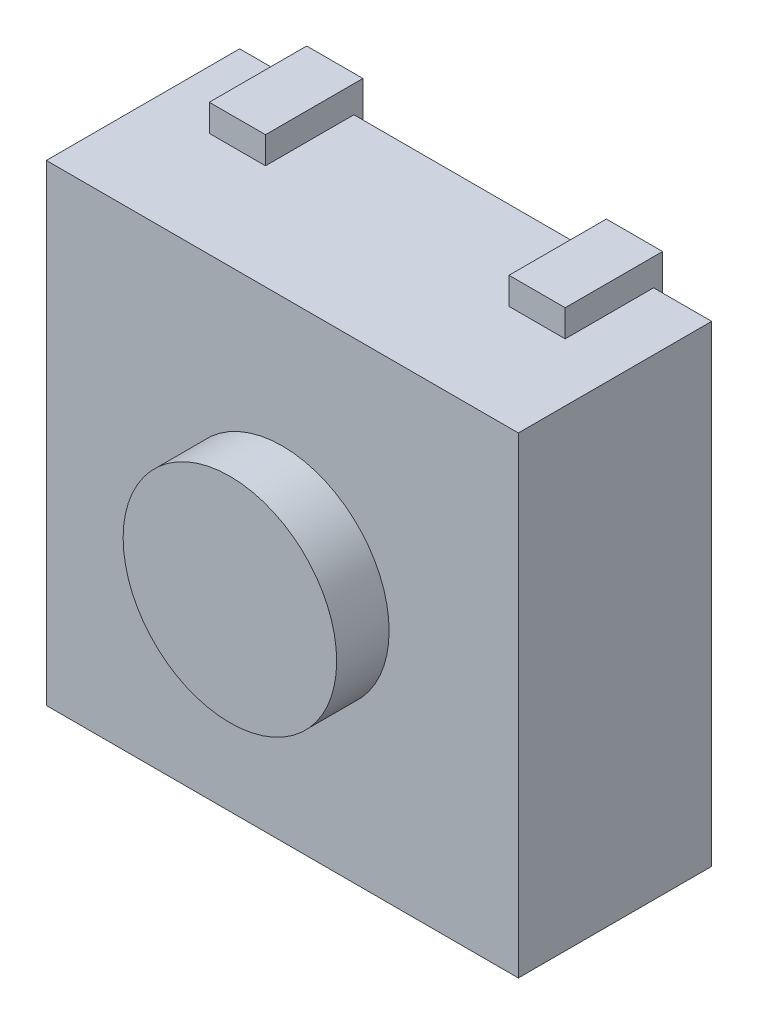
ISO-10303-21;
HEADER;
FILE_DESCRIPTION(('STEP AP214'),'2;1');
FILE_NAME('part.step','',(''),(''),'','','');
FILE_SCHEMA(('AUTOMOTIVE_DESIGN { 1 0 10303 214 1 1 1 1 }'));
ENDSEC;
DATA;
#1=APPLICATION_CONTEXT('core data for automotive mechanical design processes');
#2=APPLICATION_PROTOCOL_DEFINITION('international standard','automotive_design',2000,#1);
#3=PRODUCT_CONTEXT('',#1,'mechanical');
#4=PRODUCT('Part','Part','',(#3));
#5=PRODUCT_RELATED_PRODUCT_CATEGORY('part','',(#4));
#6=PRODUCT_DEFINITION_FORMATION('','',#4);
#7=PRODUCT_DEFINITION_CONTEXT('part definition',#1,'design');
#8=PRODUCT_DEFINITION('design','',#6,#7);
#9=PRODUCT_DEFINITION_SHAPE('','',#8);
#10=(LENGTH_UNIT() NAMED_UNIT(*) SI_UNIT(.MILLI.,.METRE.));
#11=(NAMED_UNIT(*) PLANE_ANGLE_UNIT() SI_UNIT($,.RADIAN.));
#12=(NAMED_UNIT(*) SI_UNIT($,.STERADIAN.) SOLID_ANGLE_UNIT());
#13=UNCERTAINTY_MEASURE_WITH_UNIT(LENGTH_MEASURE(1.E-05),#10,'distance_accuracy_value','');
#14=(GEOMETRIC_REPRESENTATION_CONTEXT(3) GLOBAL_UNCERTAINTY_ASSIGNED_CONTEXT((#13)) GLOBAL_UNIT_ASSIGNED_CONTEXT((#10,
#11,#12)) REPRESENTATION_CONTEXT('',''));
#15=CARTESIAN_POINT('',(0.,0.,0.));
#16=DIRECTION('',(0.,0.,1.));
#17=DIRECTION('',(1.,0.,0.));
#18=AXIS2_PLACEMENT_3D('',#15,#16,#17);
#19=CARTESIAN_POINT('',(0.,0.,0.12));
#20=DIRECTION('',(0.,0.,-1.));
#21=DIRECTION('',(-1.,0.,0.));
#22=AXIS2_PLACEMENT_3D('',#19,#20,#21);
#23=PLANE('',#22);
#24=DIRECTION('',(-1.,0.,0.));
#25=VECTOR('',#24,1.);
#26=CARTESIAN_POINT('',(0.,-1.9,0.12));
#27=LINE('',#26,#25);
#28=CARTESIAN_POINT('',(2.375,-1.9,0.12));
#29=VERTEX_POINT('',#28);
#30=CARTESIAN_POINT('',(1.625,-1.9,0.12));
#31=VERTEX_POINT('',#30);
#32=EDGE_CURVE('E12',#29,#31,#27,.T.);
#33=ORIENTED_EDGE('',*,*,#32,.T.);
#34=DIRECTION('',(0.,-1.,0.));
#35=VECTOR('',#34,1.);
#36=CARTESIAN_POINT('',(1.625,0.,0.12));
#37=LINE('',#36,#35);
#38=CARTESIAN_POINT('',(1.625,-3.15,0.12));
#39=VERTEX_POINT('',#38);
#40=EDGE_CURVE('E247',#31,#39,#37,.T.);
#41=ORIENTED_EDGE('',*,*,#40,.T.);
#42=DIRECTION('',(1.,0.,0.));
#43=VECTOR('',#42,1.);
#44=CARTESIAN_POINT('',(-3.15,-3.15,0.12));
#45=LINE('',#44,#43);
#46=CARTESIAN_POINT('',(-1.625,-3.15,0.12));
#47=VERTEX_POINT('',#46);
#48=EDGE_CURVE('E395',#47,#39,#45,.T.);
#49=ORIENTED_EDGE('',*,*,#48,.F.);
#50=DIRECTION('',(0.,-1.,0.));
#51=VECTOR('',#50,1.);
#52=CARTESIAN_POINT('',(-1.625,0.,0.12));
#53=LINE('',#52,#51);
#54=CARTESIAN_POINT('',(-1.625,-1.9,0.12));
#55=VERTEX_POINT('',#54);
#56=EDGE_CURVE('E285',#55,#47,#53,.T.);
#57=ORIENTED_EDGE('',*,*,#56,.F.);
#58=DIRECTION('',(1.,0.,0.));
#59=VECTOR('',#58,1.);
#60=CARTESIAN_POINT('',(0.,-1.9,0.12));
#61=LINE('',#60,#59);
#62=CARTESIAN_POINT('',(-2.375,-1.9,0.12));
#63=VERTEX_POINT('',#62);
#64=EDGE_CURVE('E425',#63,#55,#61,.T.);
#65=ORIENTED_EDGE('',*,*,#64,.F.);
#66=DIRECTION('',(0.,1.,0.));
#67=VECTOR('',#66,1.);
#68=CARTESIAN_POINT('',(-2.375,0.,0.12));
#69=LINE('',#68,#67);
#70=CARTESIAN_POINT('',(-2.375,-3.15,0.12));
#71=VERTEX_POINT('',#70);
#72=EDGE_CURVE('E282',#71,#63,#69,.T.);
#73=ORIENTED_EDGE('',*,*,#72,.F.);
#74=CARTESIAN_POINT('',(-3.15,-3.15,0.12));
#75=VERTEX_POINT('',#74);
#76=EDGE_CURVE('E366',#75,#71,#45,.T.);
#77=ORIENTED_EDGE('',*,*,#76,.F.);
#78=DIRECTION('',(0.,-1.,0.));
#79=VECTOR('',#78,1.);
#80=CARTESIAN_POINT('',(-3.15,-3.15,0.12));
#81=LINE('',#80,#79);
#82=CARTESIAN_POINT('',(-3.15,3.15,0.12));
#83=VERTEX_POINT('',#82);
#84=EDGE_CURVE('E389',#83,#75,#81,.T.);
#85=ORIENTED_EDGE('',*,*,#84,.F.);
#86=DIRECTION('',(-1.,0.,0.));
#87=VECTOR('',#86,1.);
#88=CARTESIAN_POINT('',(-3.15,3.15,0.12));
#89=LINE('',#88,#87);
#90=CARTESIAN_POINT('',(-2.375,3.15,0.12));
#91=VERTEX_POINT('',#90);
#92=EDGE_CURVE('E385',#91,#83,#89,.T.);
#93=ORIENTED_EDGE('',*,*,#92,.F.);
#94=DIRECTION('',(0.,-1.,0.));
#95=VECTOR('',#94,1.);
#96=CARTESIAN_POINT('',(-2.375,0.,0.12));
#97=LINE('',#96,#95);
#98=CARTESIAN_POINT('',(-2.375,1.9,0.12));
#99=VERTEX_POINT('',#98);
#100=EDGE_CURVE('E398',#91,#99,#97,.T.);
#101=ORIENTED_EDGE('',*,*,#100,.T.);
#102=DIRECTION('',(1.,0.,0.));
#103=VECTOR('',#102,1.);
#104=CARTESIAN_POINT('',(0.,1.9,0.12));
#105=LINE('',#104,#103);
#106=CARTESIAN_POINT('',(-1.625,1.9,0.12));
#107=VERTEX_POINT('',#106);
#108=EDGE_CURVE('E360',#99,#107,#105,.T.);
#109=ORIENTED_EDGE('',*,*,#108,.T.);
#110=DIRECTION('',(0.,1.,0.));
#111=VECTOR('',#110,1.);
#112=CARTESIAN_POINT('',(-1.625,0.,0.12));
#113=LINE('',#112,#111);
#114=CARTESIAN_POINT('',(-1.625,3.15,0.12));
#115=VERTEX_POINT('',#114);
#116=EDGE_CURVE('E401',#107,#115,#113,.T.);
#117=ORIENTED_EDGE('',*,*,#116,.T.);
#118=CARTESIAN_POINT('',(1.625,3.15,0.12));
#119=VERTEX_POINT('',#118);
#120=EDGE_CURVE('E390',#119,#115,#89,.T.);
#121=ORIENTED_EDGE('',*,*,#120,.F.);
#122=DIRECTION('',(0.,1.,0.));
#123=VECTOR('',#122,1.);
#124=CARTESIAN_POINT('',(1.625,0.,0.12));
#125=LINE('',#124,#123);
#126=CARTESIAN_POINT('',(1.625,1.9,0.12));
#127=VERTEX_POINT('',#126);
#128=EDGE_CURVE('E412',#127,#119,#125,.T.);
#129=ORIENTED_EDGE('',*,*,#128,.F.);
#130=DIRECTION('',(-1.,0.,0.));
#131=VECTOR('',#130,1.);
#132=CARTESIAN_POINT('',(0.,1.9,0.12));
#133=LINE('',#132,#131);
#134=CARTESIAN_POINT('',(2.375,1.9,0.12));
#135=VERTEX_POINT('',#134);
#136=EDGE_CURVE('E409',#135,#127,#133,.T.);
#137=ORIENTED_EDGE('',*,*,#136,.F.);
#138=DIRECTION('',(0.,-1.,0.));
#139=VECTOR('',#138,1.);
#140=CARTESIAN_POINT('',(2.375,0.,0.12));
#141=LINE('',#140,#139);
#142=CARTESIAN_POINT('',(2.375,3.15,0.12));
#143=VERTEX_POINT('',#142);
#144=EDGE_CURVE('E406',#143,#135,#141,.T.);
#145=ORIENTED_EDGE('',*,*,#144,.F.);
#146=CARTESIAN_POINT('',(3.15,3.15,0.12));
#147=VERTEX_POINT('',#146);
#148=EDGE_CURVE('E386',#147,#143,#89,.T.);
#149=ORIENTED_EDGE('',*,*,#148,.F.);
#150=DIRECTION('',(0.,1.,0.));
#151=VECTOR('',#150,1.);
#152=CARTESIAN_POINT('',(3.15,-3.15,0.12));
#153=LINE('',#152,#151);
#154=CARTESIAN_POINT('',(3.15,-3.15,0.12));
#155=VERTEX_POINT('',#154);
#156=EDGE_CURVE('E356',#155,#147,#153,.T.);
#157=ORIENTED_EDGE('',*,*,#156,.F.);
#158=CARTESIAN_POINT('',(2.375,-3.15,0.12));
#159=VERTEX_POINT('',#158);
#160=EDGE_CURVE('E392',#159,#155,#45,.T.);
#161=ORIENTED_EDGE('',*,*,#160,.F.);
#162=DIRECTION('',(0.,1.,0.));
#163=VECTOR('',#162,1.);
#164=CARTESIAN_POINT('',(2.375,0.,0.12));
#165=LINE('',#164,#163);
#166=EDGE_CURVE('E57',#159,#29,#165,.T.);
#167=ORIENTED_EDGE('',*,*,#166,.T.);
#168=EDGE_LOOP('',(#33,#41,#49,#57,#65,#73,#77,#85,#93,#101,#109,#117,#121,#129,#137,#145,#149,
#157,#161,#167));
#169=FACE_BOUND('',#168,.T.);
#170=ADVANCED_FACE('F40',(#169),#23,.T.);
#171=CARTESIAN_POINT('',(-3.15,-3.15,2.7));
#172=DIRECTION('',(0.,1.,0.));
#173=DIRECTION('',(0.,0.,1.));
#174=AXIS2_PLACEMENT_3D('',#171,#172,#173);
#175=PLANE('',#174);
#176=DIRECTION('',(0.,0.,-1.));
#177=VECTOR('',#176,1.);
#178=CARTESIAN_POINT('',(1.625,-3.15,2.7));
#179=LINE('',#178,#177);
#180=CARTESIAN_POINT('',(1.625,-3.15,1.3));
#181=VERTEX_POINT('',#180);
#182=EDGE_CURVE('E47',#181,#39,#179,.T.);
#183=ORIENTED_EDGE('',*,*,#182,.F.);
#184=DIRECTION('',(-1.,0.,0.));
#185=VECTOR('',#184,1.);
#186=CARTESIAN_POINT('',(-3.15,-3.15,1.3));
#187=LINE('',#186,#185);
#188=CARTESIAN_POINT('',(2.375,-3.15,1.3));
#189=VERTEX_POINT('',#188);
#190=EDGE_CURVE('E227',#189,#181,#187,.T.);
#191=ORIENTED_EDGE('',*,*,#190,.F.);
#192=DIRECTION('',(0.,0.,1.));
#193=VECTOR('',#192,1.);
#194=CARTESIAN_POINT('',(2.375,-3.15,2.7));
#195=LINE('',#194,#193);
#196=EDGE_CURVE('E429',#159,#189,#195,.T.);
#197=ORIENTED_EDGE('',*,*,#196,.F.);
#198=ORIENTED_EDGE('',*,*,#160,.T.);
#199=DIRECTION('',(0.,0.,-1.));
#200=VECTOR('',#199,1.);
#201=CARTESIAN_POINT('',(3.15,-3.15,2.7));
#202=LINE('',#201,#200);
#203=CARTESIAN_POINT('',(3.15,-3.15,2.7));
#204=VERTEX_POINT('',#203);
#205=EDGE_CURVE('E372',#204,#155,#202,.T.);
#206=ORIENTED_EDGE('',*,*,#205,.F.);
#207=DIRECTION('',(1.,0.,0.));
#208=VECTOR('',#207,1.);
#209=CARTESIAN_POINT('',(-3.15,-3.15,2.7));
#210=LINE('',#209,#208);
#211=CARTESIAN_POINT('',(-3.15,-3.15,2.7));
#212=VERTEX_POINT('',#211);
#213=EDGE_CURVE('E370',#212,#204,#210,.T.);
#214=ORIENTED_EDGE('',*,*,#213,.F.);
#215=DIRECTION('',(0.,0.,-1.));
#216=VECTOR('',#215,1.);
#217=CARTESIAN_POINT('',(-3.15,-3.15,2.7));
#218=LINE('',#217,#216);
#219=EDGE_CURVE('E375',#212,#75,#218,.T.);
#220=ORIENTED_EDGE('',*,*,#219,.T.);
#221=ORIENTED_EDGE('',*,*,#76,.T.);
#222=DIRECTION('',(0.,0.,1.));
#223=VECTOR('',#222,1.);
#224=CARTESIAN_POINT('',(-2.375,-3.15,2.7));
#225=LINE('',#224,#223);
#226=CARTESIAN_POINT('',(-2.375,-3.15,1.3));
#227=VERTEX_POINT('',#226);
#228=EDGE_CURVE('E421',#71,#227,#225,.T.);
#229=ORIENTED_EDGE('',*,*,#228,.T.);
#230=DIRECTION('',(-1.,0.,0.));
#231=VECTOR('',#230,1.);
#232=CARTESIAN_POINT('',(-3.15,-3.15,1.3));
#233=LINE('',#232,#231);
#234=CARTESIAN_POINT('',(-1.625,-3.15,1.3));
#235=VERTEX_POINT('',#234);
#236=EDGE_CURVE('E418',#235,#227,#233,.T.);
#237=ORIENTED_EDGE('',*,*,#236,.F.);
#238=DIRECTION('',(0.,0.,-1.));
#239=VECTOR('',#238,1.);
#240=CARTESIAN_POINT('',(-1.625,-3.15,2.7));
#241=LINE('',#240,#239);
#242=EDGE_CURVE('E423',#235,#47,#241,.T.);
#243=ORIENTED_EDGE('',*,*,#242,.T.);
#244=ORIENTED_EDGE('',*,*,#48,.T.);
#245=EDGE_LOOP('',(#183,#191,#197,#198,#206,#214,#220,#221,#229,#237,#243,#244));
#246=FACE_BOUND('',#245,.T.);
#247=ADVANCED_FACE('F434',(#246),#175,.F.);
#248=CARTESIAN_POINT('',(-3.15,3.15,2.7));
#249=DIRECTION('',(0.,-1.,0.));
#250=DIRECTION('',(0.,0.,-1.));
#251=AXIS2_PLACEMENT_3D('',#248,#249,#250);
#252=PLANE('',#251);
#253=DIRECTION('',(1.,0.,0.));
#254=VECTOR('',#253,1.);
#255=CARTESIAN_POINT('',(-3.15,3.15,1.3));
#256=LINE('',#255,#254);
#257=CARTESIAN_POINT('',(1.625,3.15,1.3));
#258=VERTEX_POINT('',#257);
#259=CARTESIAN_POINT('',(2.375,3.15,1.3));
#260=VERTEX_POINT('',#259);
#261=EDGE_CURVE('E415',#258,#260,#256,.T.);
#262=ORIENTED_EDGE('',*,*,#261,.F.);
#263=DIRECTION('',(0.,0.,-1.));
#264=VECTOR('',#263,1.);
#265=CARTESIAN_POINT('',(1.625,3.15,2.7));
#266=LINE('',#265,#264);
#267=EDGE_CURVE('E318',#258,#119,#266,.T.);
#268=ORIENTED_EDGE('',*,*,#267,.T.);
#269=ORIENTED_EDGE('',*,*,#120,.T.);
#270=DIRECTION('',(0.,0.,-1.));
#271=VECTOR('',#270,1.);
#272=CARTESIAN_POINT('',(-1.625,3.15,2.7));
#273=LINE('',#272,#271);
#274=CARTESIAN_POINT('',(-1.625,3.15,1.3));
#275=VERTEX_POINT('',#274);
#276=EDGE_CURVE('E350',#275,#115,#273,.T.);
#277=ORIENTED_EDGE('',*,*,#276,.F.);
#278=DIRECTION('',(1.,0.,0.));
#279=VECTOR('',#278,1.);
#280=CARTESIAN_POINT('',(-3.15,3.15,1.3));
#281=LINE('',#280,#279);
#282=CARTESIAN_POINT('',(-2.375,3.15,1.3));
#283=VERTEX_POINT('',#282);
#284=EDGE_CURVE('E404',#283,#275,#281,.T.);
#285=ORIENTED_EDGE('',*,*,#284,.F.);
#286=DIRECTION('',(0.,0.,1.));
#287=VECTOR('',#286,1.);
#288=CARTESIAN_POINT('',(-2.375,3.15,2.7));
#289=LINE('',#288,#287);
#290=EDGE_CURVE('E348',#91,#283,#289,.T.);
#291=ORIENTED_EDGE('',*,*,#290,.F.);
#292=ORIENTED_EDGE('',*,*,#92,.T.);
#293=DIRECTION('',(0.,0.,-1.));
#294=VECTOR('',#293,1.);
#295=CARTESIAN_POINT('',(-3.15,3.15,2.7));
#296=LINE('',#295,#294);
#297=CARTESIAN_POINT('',(-3.15,3.15,2.7));
#298=VERTEX_POINT('',#297);
#299=EDGE_CURVE('E378',#298,#83,#296,.T.);
#300=ORIENTED_EDGE('',*,*,#299,.F.);
#301=DIRECTION('',(-1.,0.,0.));
#302=VECTOR('',#301,1.);
#303=CARTESIAN_POINT('',(-3.15,3.15,2.7));
#304=LINE('',#303,#302);
#305=CARTESIAN_POINT('',(3.15,3.15,2.7));
#306=VERTEX_POINT('',#305);
#307=EDGE_CURVE('E365',#306,#298,#304,.T.);
#308=ORIENTED_EDGE('',*,*,#307,.F.);
#309=DIRECTION('',(0.,0.,-1.));
#310=VECTOR('',#309,1.);
#311=CARTESIAN_POINT('',(3.15,3.15,2.7));
#312=LINE('',#311,#310);
#313=EDGE_CURVE('E361',#306,#147,#312,.T.);
#314=ORIENTED_EDGE('',*,*,#313,.T.);
#315=ORIENTED_EDGE('',*,*,#148,.T.);
#316=DIRECTION('',(0.,0.,1.));
#317=VECTOR('',#316,1.);
#318=CARTESIAN_POINT('',(2.375,3.15,2.7));
#319=LINE('',#318,#317);
#320=EDGE_CURVE('E316',#143,#260,#319,.T.);
#321=ORIENTED_EDGE('',*,*,#320,.T.);
#322=EDGE_LOOP('',(#262,#268,#269,#277,#285,#291,#292,#300,#308,#314,#315,#321));
#323=FACE_BOUND('',#322,.T.);
#324=ADVANCED_FACE('F446',(#323),#252,.F.);
#325=CARTESIAN_POINT('',(3.15,-3.15,2.7));
#326=DIRECTION('',(-1.,0.,0.));
#327=DIRECTION('',(0.,0.,1.));
#328=AXIS2_PLACEMENT_3D('',#325,#326,#327);
#329=PLANE('',#328);
#330=ORIENTED_EDGE('',*,*,#156,.T.);
#331=ORIENTED_EDGE('',*,*,#313,.F.);
#332=DIRECTION('',(0.,1.,0.));
#333=VECTOR('',#332,1.);
#334=CARTESIAN_POINT('',(3.15,-3.15,2.7));
#335=LINE('',#334,#333);
#336=EDGE_CURVE('E362',#204,#306,#335,.T.);
#337=ORIENTED_EDGE('',*,*,#336,.F.);
#338=ORIENTED_EDGE('',*,*,#205,.T.);
#339=EDGE_LOOP('',(#330,#331,#337,#338));
#340=FACE_BOUND('',#339,.T.);
#341=ADVANCED_FACE('F442',(#340),#329,.F.);
#342=CARTESIAN_POINT('',(-3.15,-3.15,2.7));
#343=DIRECTION('',(1.,0.,0.));
#344=DIRECTION('',(0.,0.,-1.));
#345=AXIS2_PLACEMENT_3D('',#342,#343,#344);
#346=PLANE('',#345);
#347=ORIENTED_EDGE('',*,*,#84,.T.);
#348=ORIENTED_EDGE('',*,*,#219,.F.);
#349=DIRECTION('',(0.,-1.,0.));
#350=VECTOR('',#349,1.);
#351=CARTESIAN_POINT('',(-3.15,-3.15,2.7));
#352=LINE('',#351,#350);
#353=EDGE_CURVE('E368',#298,#212,#352,.T.);
#354=ORIENTED_EDGE('',*,*,#353,.F.);
#355=ORIENTED_EDGE('',*,*,#299,.T.);
#356=EDGE_LOOP('',(#347,#348,#354,#355));
#357=FACE_BOUND('',#356,.T.);
#358=ADVANCED_FACE('F502',(#357),#346,.F.);
#359=CARTESIAN_POINT('',(0.,0.,2.7));
#360=DIRECTION('',(0.,0.,-1.));
#361=DIRECTION('',(-1.,0.,0.));
#362=AXIS2_PLACEMENT_3D('',#359,#360,#361);
#363=PLANE('',#362);
#364=CARTESIAN_POINT('',(0.,0.,2.7));
#365=DIRECTION('',(0.,0.,-1.));
#366=DIRECTION('',(-1.,0.,0.));
#367=AXIS2_PLACEMENT_3D('',#364,#365,#366);
#368=CIRCLE('',#367,1.425);
#369=CARTESIAN_POINT('',(-1.425,0.,2.7));
#370=VERTEX_POINT('',#369);
#371=EDGE_CURVE('E357',#370,#370,#368,.F.);
#372=ORIENTED_EDGE('',*,*,#371,.F.);
#373=EDGE_LOOP('',(#372));
#374=FACE_BOUND('',#373,.T.);
#375=ORIENTED_EDGE('',*,*,#336,.T.);
#376=ORIENTED_EDGE('',*,*,#307,.T.);
#377=ORIENTED_EDGE('',*,*,#353,.T.);
#378=ORIENTED_EDGE('',*,*,#213,.T.);
#379=EDGE_LOOP('',(#375,#376,#377,#378));
#380=FACE_BOUND('',#379,.T.);
#381=ADVANCED_FACE('F450',(#374,#380),#363,.F.);
#382=CARTESIAN_POINT('',(0.,0.,3.4));
#383=DIRECTION('',(0.,0.,-1.));
#384=DIRECTION('',(-1.,0.,0.));
#385=AXIS2_PLACEMENT_3D('',#382,#383,#384);
#386=CYLINDRICAL_SURFACE('',#385,1.425);
#387=CARTESIAN_POINT('',(0.,0.,3.4));
#388=DIRECTION('',(0.,0.,1.));
#389=DIRECTION('',(1.,0.,0.));
#390=AXIS2_PLACEMENT_3D('',#387,#388,#389);
#391=CIRCLE('',#390,1.425);
#392=CARTESIAN_POINT('',(1.425,0.,3.4));
#393=VERTEX_POINT('',#392);
#394=EDGE_CURVE('E353',#393,#393,#391,.T.);
#395=ORIENTED_EDGE('',*,*,#394,.F.);
#396=EDGE_LOOP('',(#395));
#397=FACE_BOUND('',#396,.T.);
#398=ORIENTED_EDGE('',*,*,#371,.T.);
#399=EDGE_LOOP('',(#398));
#400=FACE_BOUND('',#399,.T.);
#401=ADVANCED_FACE('F751',(#397,#400),#386,.T.);
#402=CARTESIAN_POINT('',(0.,0.,3.4));
#403=DIRECTION('',(0.,0.,1.));
#404=DIRECTION('',(1.,0.,0.));
#405=AXIS2_PLACEMENT_3D('',#402,#403,#404);
#406=PLANE('',#405);
#407=ORIENTED_EDGE('',*,*,#394,.T.);
#408=EDGE_LOOP('',(#407));
#409=FACE_BOUND('',#408,.T.);
#410=ADVANCED_FACE('F512',(#409),#406,.T.);
#411=CARTESIAN_POINT('',(0.,0.,1.3));
#412=DIRECTION('',(0.,0.,-1.));
#413=DIRECTION('',(-1.,0.,0.));
#414=AXIS2_PLACEMENT_3D('',#411,#412,#413);
#415=PLANE('',#414);
#416=DIRECTION('',(0.,-1.,0.));
#417=VECTOR('',#416,1.);
#418=CARTESIAN_POINT('',(-2.375,3.51,1.3));
#419=LINE('',#418,#417);
#420=CARTESIAN_POINT('',(-2.375,3.51,1.3));
#421=VERTEX_POINT('',#420);
#422=EDGE_CURVE('E326',#421,#283,#419,.T.);
#423=ORIENTED_EDGE('',*,*,#422,.T.);
#424=ORIENTED_EDGE('',*,*,#284,.T.);
#425=DIRECTION('',(0.,1.,0.));
#426=VECTOR('',#425,1.);
#427=CARTESIAN_POINT('',(-1.625,1.9,1.3));
#428=LINE('',#427,#426);
#429=CARTESIAN_POINT('',(-1.625,3.51,1.3));
#430=VERTEX_POINT('',#429);
#431=EDGE_CURVE('E321',#275,#430,#428,.T.);
#432=ORIENTED_EDGE('',*,*,#431,.T.);
#433=DIRECTION('',(-1.,0.,0.));
#434=VECTOR('',#433,1.);
#435=CARTESIAN_POINT('',(-2.375,3.51,1.3));
#436=LINE('',#435,#434);
#437=EDGE_CURVE('E323',#430,#421,#436,.T.);
#438=ORIENTED_EDGE('',*,*,#437,.T.);
#439=EDGE_LOOP('',(#423,#424,#432,#438));
#440=FACE_BOUND('',#439,.T.);
#441=ADVANCED_FACE('F522',(#440),#415,.F.);
#442=CARTESIAN_POINT('',(-1.625,1.9,1.3));
#443=DIRECTION('',(-1.,0.,0.));
#444=DIRECTION('',(0.,-1.,0.));
#445=AXIS2_PLACEMENT_3D('',#442,#443,#444);
#446=PLANE('',#445);
#447=ORIENTED_EDGE('',*,*,#431,.F.);
#448=ORIENTED_EDGE('',*,*,#276,.T.);
#449=ORIENTED_EDGE('',*,*,#116,.F.);
#450=DIRECTION('',(0.,0.,-1.));
#451=VECTOR('',#450,1.);
#452=CARTESIAN_POINT('',(-1.625,1.9,1.3));
#453=LINE('',#452,#451);
#454=CARTESIAN_POINT('',(-1.625,1.9,0.));
#455=VERTEX_POINT('',#454);
#456=EDGE_CURVE('E329',#107,#455,#453,.T.);
#457=ORIENTED_EDGE('',*,*,#456,.T.);
#458=DIRECTION('',(0.,1.,0.));
#459=VECTOR('',#458,1.);
#460=CARTESIAN_POINT('',(-1.625,1.9,0.));
#461=LINE('',#460,#459);
#462=CARTESIAN_POINT('',(-1.625,3.51,0.));
#463=VERTEX_POINT('',#462);
#464=EDGE_CURVE('E320',#455,#463,#461,.T.);
#465=ORIENTED_EDGE('',*,*,#464,.T.);
#466=DIRECTION('',(0.,0.,-1.));
#467=VECTOR('',#466,1.);
#468=CARTESIAN_POINT('',(-1.625,3.51,1.3));
#469=LINE('',#468,#467);
#470=EDGE_CURVE('E345',#430,#463,#469,.T.);
#471=ORIENTED_EDGE('',*,*,#470,.F.);
#472=EDGE_LOOP('',(#447,#448,#449,#457,#465,#471));
#473=FACE_BOUND('',#472,.T.);
#474=ADVANCED_FACE('F526',(#473),#446,.F.);
#475=CARTESIAN_POINT('',(-2.375,3.51,1.3));
#476=DIRECTION('',(1.,0.,0.));
#477=DIRECTION('',(0.,0.,-1.));
#478=AXIS2_PLACEMENT_3D('',#475,#476,#477);
#479=PLANE('',#478);
#480=ORIENTED_EDGE('',*,*,#100,.F.);
#481=ORIENTED_EDGE('',*,*,#290,.T.);
#482=ORIENTED_EDGE('',*,*,#422,.F.);
#483=DIRECTION('',(0.,0.,-1.));
#484=VECTOR('',#483,1.);
#485=CARTESIAN_POINT('',(-2.375,3.51,1.3));
#486=LINE('',#485,#484);
#487=CARTESIAN_POINT('',(-2.375,3.51,0.));
#488=VERTEX_POINT('',#487);
#489=EDGE_CURVE('E342',#421,#488,#486,.T.);
#490=ORIENTED_EDGE('',*,*,#489,.T.);
#491=DIRECTION('',(0.,-1.,0.));
#492=VECTOR('',#491,1.);
#493=CARTESIAN_POINT('',(-2.375,3.51,0.));
#494=LINE('',#493,#492);
#495=CARTESIAN_POINT('',(-2.375,1.9,0.));
#496=VERTEX_POINT('',#495);
#497=EDGE_CURVE('E334',#488,#496,#494,.T.);
#498=ORIENTED_EDGE('',*,*,#497,.T.);
#499=DIRECTION('',(0.,0.,-1.));
#500=VECTOR('',#499,1.);
#501=CARTESIAN_POINT('',(-2.375,1.9,1.3));
#502=LINE('',#501,#500);
#503=EDGE_CURVE('E340',#99,#496,#502,.T.);
#504=ORIENTED_EDGE('',*,*,#503,.F.);
#505=EDGE_LOOP('',(#480,#481,#482,#490,#498,#504));
#506=FACE_BOUND('',#505,.T.);
#507=ADVANCED_FACE('F536',(#506),#479,.F.);
#508=CARTESIAN_POINT('',(-2.375,3.51,1.3));
#509=DIRECTION('',(0.,-1.,0.));
#510=DIRECTION('',(0.,0.,-1.));
#511=AXIS2_PLACEMENT_3D('',#508,#509,#510);
#512=PLANE('',#511);
#513=DIRECTION('',(-1.,0.,0.));
#514=VECTOR('',#513,1.);
#515=CARTESIAN_POINT('',(-2.375,3.51,0.));
#516=LINE('',#515,#514);
#517=EDGE_CURVE('E332',#463,#488,#516,.T.);
#518=ORIENTED_EDGE('',*,*,#517,.T.);
#519=ORIENTED_EDGE('',*,*,#489,.F.);
#520=ORIENTED_EDGE('',*,*,#437,.F.);
#521=ORIENTED_EDGE('',*,*,#470,.T.);
#522=EDGE_LOOP('',(#518,#519,#520,#521));
#523=FACE_BOUND('',#522,.T.);
#524=ADVANCED_FACE('F545',(#523),#512,.F.);
#525=CARTESIAN_POINT('',(-2.375,1.9,1.3));
#526=DIRECTION('',(0.,1.,0.));
#527=DIRECTION('',(-1.,0.,0.));
#528=AXIS2_PLACEMENT_3D('',#525,#526,#527);
#529=PLANE('',#528);
#530=ORIENTED_EDGE('',*,*,#108,.F.);
#531=ORIENTED_EDGE('',*,*,#503,.T.);
#532=DIRECTION('',(1.,0.,0.));
#533=VECTOR('',#532,1.);
#534=CARTESIAN_POINT('',(-2.375,1.9,0.));
#535=LINE('',#534,#533);
#536=EDGE_CURVE('E324',#496,#455,#535,.T.);
#537=ORIENTED_EDGE('',*,*,#536,.T.);
#538=ORIENTED_EDGE('',*,*,#456,.F.);
#539=EDGE_LOOP('',(#530,#531,#537,#538));
#540=FACE_BOUND('',#539,.T.);
#541=ADVANCED_FACE('F554',(#540),#529,.F.);
#542=CARTESIAN_POINT('',(0.,0.,0.));
#543=DIRECTION('',(0.,0.,-1.));
#544=DIRECTION('',(-1.,0.,0.));
#545=AXIS2_PLACEMENT_3D('',#542,#543,#544);
#546=PLANE('',#545);
#547=ORIENTED_EDGE('',*,*,#464,.F.);
#548=ORIENTED_EDGE('',*,*,#536,.F.);
#549=ORIENTED_EDGE('',*,*,#497,.F.);
#550=ORIENTED_EDGE('',*,*,#517,.F.);
#551=EDGE_LOOP('',(#547,#548,#549,#550));
#552=FACE_BOUND('',#551,.T.);
#553=ADVANCED_FACE('F562',(#552),#546,.T.);
#554=CARTESIAN_POINT('',(0.,0.,1.3));
#555=DIRECTION('',(0.,0.,-1.));
#556=DIRECTION('',(1.,0.,0.));
#557=AXIS2_PLACEMENT_3D('',#554,#555,#556);
#558=PLANE('',#557);
#559=DIRECTION('',(0.,1.,0.));
#560=VECTOR('',#559,1.);
#561=CARTESIAN_POINT('',(1.625,1.9,1.3));
#562=LINE('',#561,#560);
#563=CARTESIAN_POINT('',(1.625,3.51,1.3));
#564=VERTEX_POINT('',#563);
#565=EDGE_CURVE('E289',#258,#564,#562,.T.);
#566=ORIENTED_EDGE('',*,*,#565,.F.);
#567=ORIENTED_EDGE('',*,*,#261,.T.);
#568=DIRECTION('',(0.,-1.,0.));
#569=VECTOR('',#568,1.);
#570=CARTESIAN_POINT('',(2.375,3.51,1.3));
#571=LINE('',#570,#569);
#572=CARTESIAN_POINT('',(2.375,3.51,1.3));
#573=VERTEX_POINT('',#572);
#574=EDGE_CURVE('E291',#573,#260,#571,.T.);
#575=ORIENTED_EDGE('',*,*,#574,.F.);
#576=DIRECTION('',(1.,0.,0.));
#577=VECTOR('',#576,1.);
#578=CARTESIAN_POINT('',(2.375,3.51,1.3));
#579=LINE('',#578,#577);
#580=EDGE_CURVE('E295',#564,#573,#579,.T.);
#581=ORIENTED_EDGE('',*,*,#580,.F.);
#582=EDGE_LOOP('',(#566,#567,#575,#581));
#583=FACE_BOUND('',#582,.T.);
#584=ADVANCED_FACE('F570',(#583),#558,.F.);
#585=CARTESIAN_POINT('',(1.625,1.9,1.3));
#586=DIRECTION('',(-1.,0.,0.));
#587=DIRECTION('',(0.,-1.,0.));
#588=AXIS2_PLACEMENT_3D('',#585,#586,#587);
#589=PLANE('',#588);
#590=ORIENTED_EDGE('',*,*,#267,.F.);
#591=ORIENTED_EDGE('',*,*,#565,.T.);
#592=DIRECTION('',(0.,0.,-1.));
#593=VECTOR('',#592,1.);
#594=CARTESIAN_POINT('',(1.625,3.51,1.3));
#595=LINE('',#594,#593);
#596=CARTESIAN_POINT('',(1.625,3.51,0.));
#597=VERTEX_POINT('',#596);
#598=EDGE_CURVE('E298',#564,#597,#595,.T.);
#599=ORIENTED_EDGE('',*,*,#598,.T.);
#600=DIRECTION('',(0.,1.,0.));
#601=VECTOR('',#600,1.);
#602=CARTESIAN_POINT('',(1.625,1.9,0.));
#603=LINE('',#602,#601);
#604=CARTESIAN_POINT('',(1.625,1.9,0.));
#605=VERTEX_POINT('',#604);
#606=EDGE_CURVE('E288',#605,#597,#603,.T.);
#607=ORIENTED_EDGE('',*,*,#606,.F.);
#608=DIRECTION('',(0.,0.,-1.));
#609=VECTOR('',#608,1.);
#610=CARTESIAN_POINT('',(1.625,1.9,1.3));
#611=LINE('',#610,#609);
#612=EDGE_CURVE('E314',#127,#605,#611,.T.);
#613=ORIENTED_EDGE('',*,*,#612,.F.);
#614=ORIENTED_EDGE('',*,*,#128,.T.);
#615=EDGE_LOOP('',(#590,#591,#599,#607,#613,#614));
#616=FACE_BOUND('',#615,.T.);
#617=ADVANCED_FACE('F591',(#616),#589,.T.);
#618=CARTESIAN_POINT('',(2.375,3.51,1.3));
#619=DIRECTION('',(1.,0.,0.));
#620=DIRECTION('',(0.,0.,-1.));
#621=AXIS2_PLACEMENT_3D('',#618,#619,#620);
#622=PLANE('',#621);
#623=ORIENTED_EDGE('',*,*,#320,.F.);
#624=ORIENTED_EDGE('',*,*,#144,.T.);
#625=DIRECTION('',(0.,0.,-1.));
#626=VECTOR('',#625,1.);
#627=CARTESIAN_POINT('',(2.375,1.9,1.3));
#628=LINE('',#627,#626);
#629=CARTESIAN_POINT('',(2.375,1.9,0.));
#630=VERTEX_POINT('',#629);
#631=EDGE_CURVE('E312',#135,#630,#628,.T.);
#632=ORIENTED_EDGE('',*,*,#631,.T.);
#633=DIRECTION('',(0.,-1.,0.));
#634=VECTOR('',#633,1.);
#635=CARTESIAN_POINT('',(2.375,3.51,0.));
#636=LINE('',#635,#634);
#637=CARTESIAN_POINT('',(2.375,3.51,0.));
#638=VERTEX_POINT('',#637);
#639=EDGE_CURVE('E304',#638,#630,#636,.T.);
#640=ORIENTED_EDGE('',*,*,#639,.F.);
#641=DIRECTION('',(0.,0.,-1.));
#642=VECTOR('',#641,1.);
#643=CARTESIAN_POINT('',(2.375,3.51,1.3));
#644=LINE('',#643,#642);
#645=EDGE_CURVE('E310',#573,#638,#644,.T.);
#646=ORIENTED_EDGE('',*,*,#645,.F.);
#647=ORIENTED_EDGE('',*,*,#574,.T.);
#648=EDGE_LOOP('',(#623,#624,#632,#640,#646,#647));
#649=FACE_BOUND('',#648,.T.);
#650=ADVANCED_FACE('F600',(#649),#622,.T.);
#651=CARTESIAN_POINT('',(2.375,1.9,1.3));
#652=DIRECTION('',(0.,-1.,0.));
#653=DIRECTION('',(1.,0.,0.));
#654=AXIS2_PLACEMENT_3D('',#651,#652,#653);
#655=PLANE('',#654);
#656=ORIENTED_EDGE('',*,*,#631,.F.);
#657=ORIENTED_EDGE('',*,*,#136,.T.);
#658=ORIENTED_EDGE('',*,*,#612,.T.);
#659=DIRECTION('',(-1.,0.,0.));
#660=VECTOR('',#659,1.);
#661=CARTESIAN_POINT('',(2.375,1.9,0.));
#662=LINE('',#661,#660);
#663=EDGE_CURVE('E301',#630,#605,#662,.T.);
#664=ORIENTED_EDGE('',*,*,#663,.F.);
#665=EDGE_LOOP('',(#656,#657,#658,#664));
#666=FACE_BOUND('',#665,.T.);
#667=ADVANCED_FACE('F610',(#666),#655,.T.);
#668=CARTESIAN_POINT('',(2.375,3.51,1.3));
#669=DIRECTION('',(0.,1.,0.));
#670=DIRECTION('',(0.,0.,1.));
#671=AXIS2_PLACEMENT_3D('',#668,#669,#670);
#672=PLANE('',#671);
#673=DIRECTION('',(1.,0.,0.));
#674=VECTOR('',#673,1.);
#675=CARTESIAN_POINT('',(2.375,3.51,0.));
#676=LINE('',#675,#674);
#677=EDGE_CURVE('E292',#597,#638,#676,.T.);
#678=ORIENTED_EDGE('',*,*,#677,.F.);
#679=ORIENTED_EDGE('',*,*,#598,.F.);
#680=ORIENTED_EDGE('',*,*,#580,.T.);
#681=ORIENTED_EDGE('',*,*,#645,.T.);
#682=EDGE_LOOP('',(#678,#679,#680,#681));
#683=FACE_BOUND('',#682,.T.);
#684=ADVANCED_FACE('F620',(#683),#672,.T.);
#685=CARTESIAN_POINT('',(0.,0.,0.));
#686=DIRECTION('',(0.,0.,-1.));
#687=DIRECTION('',(1.,0.,0.));
#688=AXIS2_PLACEMENT_3D('',#685,#686,#687);
#689=PLANE('',#688);
#690=ORIENTED_EDGE('',*,*,#606,.T.);
#691=ORIENTED_EDGE('',*,*,#677,.T.);
#692=ORIENTED_EDGE('',*,*,#639,.T.);
#693=ORIENTED_EDGE('',*,*,#663,.T.);
#694=EDGE_LOOP('',(#690,#691,#692,#693));
#695=FACE_BOUND('',#694,.T.);
#696=ADVANCED_FACE('F486',(#695),#689,.T.);
#697=CARTESIAN_POINT('',(0.,0.,1.3));
#698=DIRECTION('',(0.,0.,-1.));
#699=DIRECTION('',(-1.,0.,0.));
#700=AXIS2_PLACEMENT_3D('',#697,#698,#699);
#701=PLANE('',#700);
#702=DIRECTION('',(0.,-1.,0.));
#703=VECTOR('',#702,1.);
#704=CARTESIAN_POINT('',(-1.625,-1.9,1.3));
#705=LINE('',#704,#703);
#706=CARTESIAN_POINT('',(-1.625,-3.51,1.3));
#707=VERTEX_POINT('',#706);
#708=EDGE_CURVE('E255',#235,#707,#705,.T.);
#709=ORIENTED_EDGE('',*,*,#708,.F.);
#710=ORIENTED_EDGE('',*,*,#236,.T.);
#711=DIRECTION('',(0.,1.,0.));
#712=VECTOR('',#711,1.);
#713=CARTESIAN_POINT('',(-2.375,-3.51,1.3));
#714=LINE('',#713,#712);
#715=CARTESIAN_POINT('',(-2.375,-3.51,1.3));
#716=VERTEX_POINT('',#715);
#717=EDGE_CURVE('E257',#716,#227,#714,.T.);
#718=ORIENTED_EDGE('',*,*,#717,.F.);
#719=DIRECTION('',(-1.,0.,0.));
#720=VECTOR('',#719,1.);
#721=CARTESIAN_POINT('',(-2.375,-3.51,1.3));
#722=LINE('',#721,#720);
#723=EDGE_CURVE('E261',#707,#716,#722,.T.);
#724=ORIENTED_EDGE('',*,*,#723,.F.);
#725=EDGE_LOOP('',(#709,#710,#718,#724));
#726=FACE_BOUND('',#725,.T.);
#727=ADVANCED_FACE('F474',(#726),#701,.F.);
#728=CARTESIAN_POINT('',(-1.625,-1.9,1.3));
#729=DIRECTION('',(1.,0.,0.));
#730=DIRECTION('',(0.,1.,0.));
#731=AXIS2_PLACEMENT_3D('',#728,#729,#730);
#732=PLANE('',#731);
#733=DIRECTION('',(0.,0.,-1.));
#734=VECTOR('',#733,1.);
#735=CARTESIAN_POINT('',(-1.625,-1.9,1.3));
#736=LINE('',#735,#734);
#737=CARTESIAN_POINT('',(-1.625,-1.9,0.));
#738=VERTEX_POINT('',#737);
#739=EDGE_CURVE('E280',#55,#738,#736,.T.);
#740=ORIENTED_EDGE('',*,*,#739,.F.);
#741=ORIENTED_EDGE('',*,*,#56,.T.);
#742=ORIENTED_EDGE('',*,*,#242,.F.);
#743=ORIENTED_EDGE('',*,*,#708,.T.);
#744=DIRECTION('',(0.,0.,-1.));
#745=VECTOR('',#744,1.);
#746=CARTESIAN_POINT('',(-1.625,-3.51,1.3));
#747=LINE('',#746,#745);
#748=CARTESIAN_POINT('',(-1.625,-3.51,0.));
#749=VERTEX_POINT('',#748);
#750=EDGE_CURVE('E264',#707,#749,#747,.T.);
#751=ORIENTED_EDGE('',*,*,#750,.T.);
#752=DIRECTION('',(0.,-1.,0.));
#753=VECTOR('',#752,1.);
#754=CARTESIAN_POINT('',(-1.625,-1.9,0.));
#755=LINE('',#754,#753);
#756=EDGE_CURVE('E254',#738,#749,#755,.T.);
#757=ORIENTED_EDGE('',*,*,#756,.F.);
#758=EDGE_LOOP('',(#740,#741,#742,#743,#751,#757));
#759=FACE_BOUND('',#758,.T.);
#760=ADVANCED_FACE('F478',(#759),#732,.T.);
#761=CARTESIAN_POINT('',(-2.375,-1.9,1.3));
#762=DIRECTION('',(0.,1.,0.));
#763=DIRECTION('',(-1.,0.,0.));
#764=AXIS2_PLACEMENT_3D('',#761,#762,#763);
#765=PLANE('',#764);
#766=DIRECTION('',(0.,0.,-1.));
#767=VECTOR('',#766,1.);
#768=CARTESIAN_POINT('',(-2.375,-1.9,1.3));
#769=LINE('',#768,#767);
#770=CARTESIAN_POINT('',(-2.375,-1.9,0.));
#771=VERTEX_POINT('',#770);
#772=EDGE_CURVE('E278',#63,#771,#769,.T.);
#773=ORIENTED_EDGE('',*,*,#772,.F.);
#774=ORIENTED_EDGE('',*,*,#64,.T.);
#775=ORIENTED_EDGE('',*,*,#739,.T.);
#776=DIRECTION('',(1.,0.,0.));
#777=VECTOR('',#776,1.);
#778=CARTESIAN_POINT('',(-2.375,-1.9,0.));
#779=LINE('',#778,#777);
#780=EDGE_CURVE('E267',#771,#738,#779,.T.);
#781=ORIENTED_EDGE('',*,*,#780,.F.);
#782=EDGE_LOOP('',(#773,#774,#775,#781));
#783=FACE_BOUND('',#782,.T.);
#784=ADVANCED_FACE('F463',(#783),#765,.T.);
#785=CARTESIAN_POINT('',(-2.375,-3.51,1.3));
#786=DIRECTION('',(-1.,0.,0.));
#787=DIRECTION('',(0.,0.,1.));
#788=AXIS2_PLACEMENT_3D('',#785,#786,#787);
#789=PLANE('',#788);
#790=ORIENTED_EDGE('',*,*,#228,.F.);
#791=ORIENTED_EDGE('',*,*,#72,.T.);
#792=ORIENTED_EDGE('',*,*,#772,.T.);
#793=DIRECTION('',(0.,1.,0.));
#794=VECTOR('',#793,1.);
#795=CARTESIAN_POINT('',(-2.375,-3.51,0.));
#796=LINE('',#795,#794);
#797=CARTESIAN_POINT('',(-2.375,-3.51,0.));
#798=VERTEX_POINT('',#797);
#799=EDGE_CURVE('E270',#798,#771,#796,.T.);
#800=ORIENTED_EDGE('',*,*,#799,.F.);
#801=DIRECTION('',(0.,0.,-1.));
#802=VECTOR('',#801,1.);
#803=CARTESIAN_POINT('',(-2.375,-3.51,1.3));
#804=LINE('',#803,#802);
#805=EDGE_CURVE('E276',#716,#798,#804,.T.);
#806=ORIENTED_EDGE('',*,*,#805,.F.);
#807=ORIENTED_EDGE('',*,*,#717,.T.);
#808=EDGE_LOOP('',(#790,#791,#792,#800,#806,#807));
#809=FACE_BOUND('',#808,.T.);
#810=ADVANCED_FACE('F459',(#809),#789,.T.);
#811=CARTESIAN_POINT('',(-2.375,-3.51,1.3));
#812=DIRECTION('',(0.,-1.,0.));
#813=DIRECTION('',(0.,0.,-1.));
#814=AXIS2_PLACEMENT_3D('',#811,#812,#813);
#815=PLANE('',#814);
#816=DIRECTION('',(-1.,0.,0.));
#817=VECTOR('',#816,1.);
#818=CARTESIAN_POINT('',(-2.375,-3.51,0.));
#819=LINE('',#818,#817);
#820=EDGE_CURVE('E258',#749,#798,#819,.T.);
#821=ORIENTED_EDGE('',*,*,#820,.F.);
#822=ORIENTED_EDGE('',*,*,#750,.F.);
#823=ORIENTED_EDGE('',*,*,#723,.T.);
#824=ORIENTED_EDGE('',*,*,#805,.T.);
#825=EDGE_LOOP('',(#821,#822,#823,#824));
#826=FACE_BOUND('',#825,.T.);
#827=ADVANCED_FACE('F476',(#826),#815,.T.);
#828=CARTESIAN_POINT('',(0.,0.,0.));
#829=DIRECTION('',(0.,0.,-1.));
#830=DIRECTION('',(-1.,0.,0.));
#831=AXIS2_PLACEMENT_3D('',#828,#829,#830);
#832=PLANE('',#831);
#833=ORIENTED_EDGE('',*,*,#756,.T.);
#834=ORIENTED_EDGE('',*,*,#820,.T.);
#835=ORIENTED_EDGE('',*,*,#799,.T.);
#836=ORIENTED_EDGE('',*,*,#780,.T.);
#837=EDGE_LOOP('',(#833,#834,#835,#836));
#838=FACE_BOUND('',#837,.T.);
#839=ADVANCED_FACE('F467',(#838),#832,.T.);
#840=CARTESIAN_POINT('',(0.,0.,1.3));
#841=DIRECTION('',(0.,0.,-1.));
#842=DIRECTION('',(1.,0.,0.));
#843=AXIS2_PLACEMENT_3D('',#840,#841,#842);
#844=PLANE('',#843);
#845=DIRECTION('',(0.,1.,0.));
#846=VECTOR('',#845,1.);
#847=CARTESIAN_POINT('',(2.375,-3.51,1.3));
#848=LINE('',#847,#846);
#849=CARTESIAN_POINT('',(2.375,-3.51,1.3));
#850=VERTEX_POINT('',#849);
#851=EDGE_CURVE('E241',#850,#189,#848,.T.);
#852=ORIENTED_EDGE('',*,*,#851,.T.);
#853=ORIENTED_EDGE('',*,*,#190,.T.);
#854=DIRECTION('',(0.,-1.,0.));
#855=VECTOR('',#854,1.);
#856=CARTESIAN_POINT('',(1.625,-1.9,1.3));
#857=LINE('',#856,#855);
#858=CARTESIAN_POINT('',(1.625,-3.51,1.3));
#859=VERTEX_POINT('',#858);
#860=EDGE_CURVE('E221',#181,#859,#857,.T.);
#861=ORIENTED_EDGE('',*,*,#860,.T.);
#862=DIRECTION('',(1.,0.,0.));
#863=VECTOR('',#862,1.);
#864=CARTESIAN_POINT('',(2.375,-3.51,1.3));
#865=LINE('',#864,#863);
#866=EDGE_CURVE('E225',#859,#850,#865,.T.);
#867=ORIENTED_EDGE('',*,*,#866,.T.);
#868=EDGE_LOOP('',(#852,#853,#861,#867));
#869=FACE_BOUND('',#868,.T.);
#870=ADVANCED_FACE('F224',(#869),#844,.F.);
#871=CARTESIAN_POINT('',(1.625,-1.9,1.3));
#872=DIRECTION('',(1.,0.,0.));
#873=DIRECTION('',(0.,1.,0.));
#874=AXIS2_PLACEMENT_3D('',#871,#872,#873);
#875=PLANE('',#874);
#876=ORIENTED_EDGE('',*,*,#40,.F.);
#877=DIRECTION('',(0.,0.,-1.));
#878=VECTOR('',#877,1.);
#879=CARTESIAN_POINT('',(1.625,-1.9,1.3));
#880=LINE('',#879,#878);
#881=CARTESIAN_POINT('',(1.625,-1.9,0.));
#882=VERTEX_POINT('',#881);
#883=EDGE_CURVE('E748',#31,#882,#880,.T.);
#884=ORIENTED_EDGE('',*,*,#883,.T.);
#885=DIRECTION('',(0.,-1.,0.));
#886=VECTOR('',#885,1.);
#887=CARTESIAN_POINT('',(1.625,-1.9,0.));
#888=LINE('',#887,#886);
#889=CARTESIAN_POINT('',(1.625,-3.51,0.));
#890=VERTEX_POINT('',#889);
#891=EDGE_CURVE('E245',#882,#890,#888,.T.);
#892=ORIENTED_EDGE('',*,*,#891,.T.);
#893=DIRECTION('',(0.,0.,-1.));
#894=VECTOR('',#893,1.);
#895=CARTESIAN_POINT('',(1.625,-3.51,1.3));
#896=LINE('',#895,#894);
#897=EDGE_CURVE('E236',#859,#890,#896,.T.);
#898=ORIENTED_EDGE('',*,*,#897,.F.);
#899=ORIENTED_EDGE('',*,*,#860,.F.);
#900=ORIENTED_EDGE('',*,*,#182,.T.);
#901=EDGE_LOOP('',(#876,#884,#892,#898,#899,#900));
#902=FACE_BOUND('',#901,.T.);
#903=ADVANCED_FACE('F243',(#902),#875,.F.);
#904=CARTESIAN_POINT('',(2.375,-3.51,1.3));
#905=DIRECTION('',(0.,1.,0.));
#906=DIRECTION('',(0.,0.,1.));
#907=AXIS2_PLACEMENT_3D('',#904,#905,#906);
#908=PLANE('',#907);
#909=DIRECTION('',(1.,0.,0.));
#910=VECTOR('',#909,1.);
#911=CARTESIAN_POINT('',(2.375,-3.51,0.));
#912=LINE('',#911,#910);
#913=CARTESIAN_POINT('',(2.375,-3.51,0.));
#914=VERTEX_POINT('',#913);
#915=EDGE_CURVE('E739',#890,#914,#912,.T.);
#916=ORIENTED_EDGE('',*,*,#915,.T.);
#917=DIRECTION('',(0.,0.,-1.));
#918=VECTOR('',#917,1.);
#919=CARTESIAN_POINT('',(2.375,-3.51,1.3));
#920=LINE('',#919,#918);
#921=EDGE_CURVE('E239',#850,#914,#920,.T.);
#922=ORIENTED_EDGE('',*,*,#921,.F.);
#923=ORIENTED_EDGE('',*,*,#866,.F.);
#924=ORIENTED_EDGE('',*,*,#897,.T.);
#925=EDGE_LOOP('',(#916,#922,#923,#924));
#926=FACE_BOUND('',#925,.T.);
#927=ADVANCED_FACE('F235',(#926),#908,.F.);
#928=CARTESIAN_POINT('',(2.375,-3.51,1.3));
#929=DIRECTION('',(-1.,0.,0.));
#930=DIRECTION('',(0.,0.,1.));
#931=AXIS2_PLACEMENT_3D('',#928,#929,#930);
#932=PLANE('',#931);
#933=ORIENTED_EDGE('',*,*,#166,.F.);
#934=ORIENTED_EDGE('',*,*,#196,.T.);
#935=ORIENTED_EDGE('',*,*,#851,.F.);
#936=ORIENTED_EDGE('',*,*,#921,.T.);
#937=DIRECTION('',(0.,1.,0.));
#938=VECTOR('',#937,1.);
#939=CARTESIAN_POINT('',(2.375,-3.51,0.));
#940=LINE('',#939,#938);
#941=CARTESIAN_POINT('',(2.375,-1.9,0.));
#942=VERTEX_POINT('',#941);
#943=EDGE_CURVE('E741',#914,#942,#940,.T.);
#944=ORIENTED_EDGE('',*,*,#943,.T.);
#945=DIRECTION('',(0.,0.,-1.));
#946=VECTOR('',#945,1.);
#947=CARTESIAN_POINT('',(2.375,-1.9,1.3));
#948=LINE('',#947,#946);
#949=EDGE_CURVE('E249',#29,#942,#948,.T.);
#950=ORIENTED_EDGE('',*,*,#949,.F.);
#951=EDGE_LOOP('',(#933,#934,#935,#936,#944,#950));
#952=FACE_BOUND('',#951,.T.);
#953=ADVANCED_FACE('F704',(#952),#932,.F.);
#954=CARTESIAN_POINT('',(2.375,-1.9,1.3));
#955=DIRECTION('',(0.,-1.,0.));
#956=DIRECTION('',(1.,0.,0.));
#957=AXIS2_PLACEMENT_3D('',#954,#955,#956);
#958=PLANE('',#957);
#959=ORIENTED_EDGE('',*,*,#32,.F.);
#960=ORIENTED_EDGE('',*,*,#949,.T.);
#961=DIRECTION('',(-1.,0.,0.));
#962=VECTOR('',#961,1.);
#963=CARTESIAN_POINT('',(2.375,-1.9,0.));
#964=LINE('',#963,#962);
#965=EDGE_CURVE('E231',#942,#882,#964,.T.);
#966=ORIENTED_EDGE('',*,*,#965,.T.);
#967=ORIENTED_EDGE('',*,*,#883,.F.);
#968=EDGE_LOOP('',(#959,#960,#966,#967));
#969=FACE_BOUND('',#968,.T.);
#970=ADVANCED_FACE('F713',(#969),#958,.F.);
#971=CARTESIAN_POINT('',(0.,0.,0.));
#972=DIRECTION('',(0.,0.,-1.));
#973=DIRECTION('',(1.,0.,0.));
#974=AXIS2_PLACEMENT_3D('',#971,#972,#973);
#975=PLANE('',#974);
#976=ORIENTED_EDGE('',*,*,#891,.F.);
#977=ORIENTED_EDGE('',*,*,#965,.F.);
#978=ORIENTED_EDGE('',*,*,#943,.F.);
#979=ORIENTED_EDGE('',*,*,#915,.F.);
#980=EDGE_LOOP('',(#976,#977,#978,#979));
#981=FACE_BOUND('',#980,.T.);
#982=ADVANCED_FACE('F723',(#981),#975,.T.);
#983=CLOSED_SHELL('',(#170,#247,#324,#341,#358,#381,#401,#410,#441,#474,#507,#524,#541,#553,
#584,#617,#650,#667,#684,#696,#727,#760,#784,#810,#827,#839,#870,#903,#927,#953,#970,#982));
#984=MANIFOLD_SOLID_BREP('B2',#983);
#985=ADVANCED_BREP_SHAPE_REPRESENTATION('',(#18,#984),#14);
#986=SHAPE_DEFINITION_REPRESENTATION(#9,#985);
ENDSEC;
END-ISO-10303-21;
